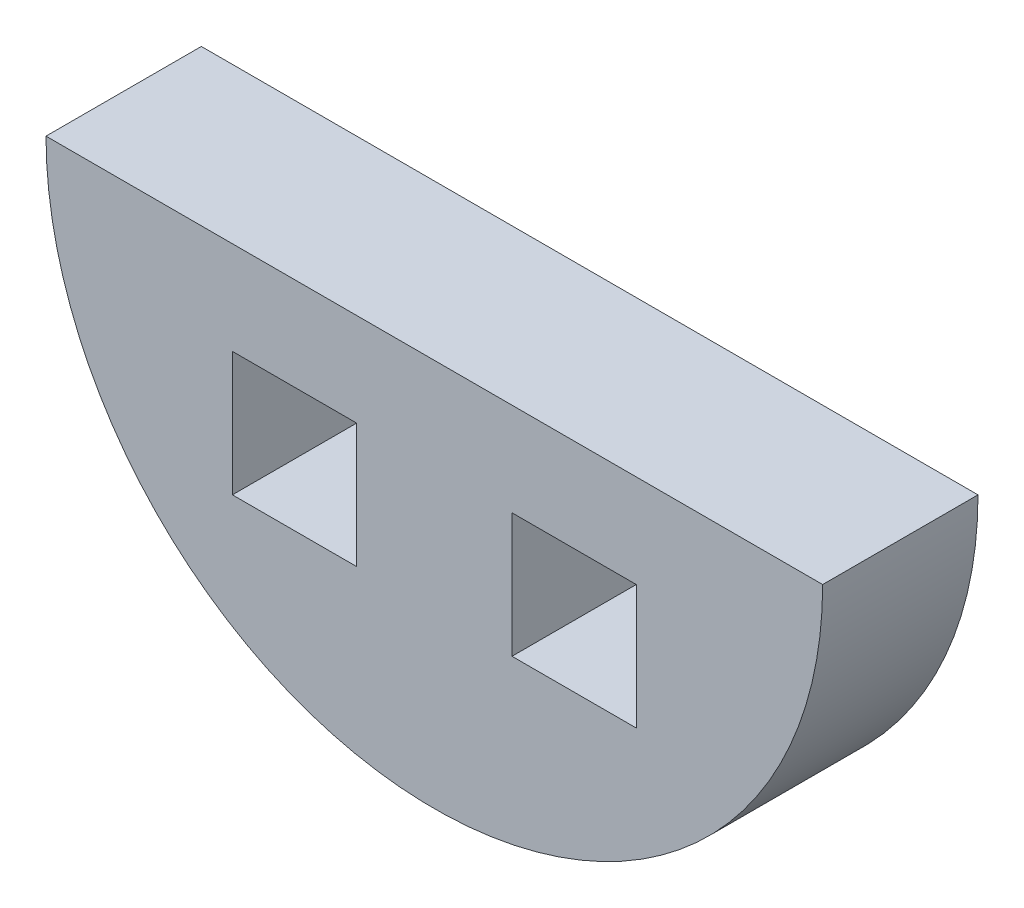
ISO-10303-21;
HEADER;
FILE_DESCRIPTION(('STEP AP214'),'2;1');
FILE_NAME('part.step','',(''),(''),'','','');
FILE_SCHEMA(('AUTOMOTIVE_DESIGN { 1 0 10303 214 1 1 1 1 }'));
ENDSEC;
DATA;
#1=APPLICATION_CONTEXT('core data for automotive mechanical design processes');
#2=APPLICATION_PROTOCOL_DEFINITION('international standard','automotive_design',2000,#1);
#3=PRODUCT_CONTEXT('',#1,'mechanical');
#4=PRODUCT('Part','Part','',(#3));
#5=PRODUCT_RELATED_PRODUCT_CATEGORY('part','',(#4));
#6=PRODUCT_DEFINITION_FORMATION('','',#4);
#7=PRODUCT_DEFINITION_CONTEXT('part definition',#1,'design');
#8=PRODUCT_DEFINITION('design','',#6,#7);
#9=PRODUCT_DEFINITION_SHAPE('','',#8);
#10=(LENGTH_UNIT() NAMED_UNIT(*) SI_UNIT(.MILLI.,.METRE.));
#11=(NAMED_UNIT(*) PLANE_ANGLE_UNIT() SI_UNIT($,.RADIAN.));
#12=(NAMED_UNIT(*) SI_UNIT($,.STERADIAN.) SOLID_ANGLE_UNIT());
#13=UNCERTAINTY_MEASURE_WITH_UNIT(LENGTH_MEASURE(1.E-05),#10,'distance_accuracy_value','');
#14=(GEOMETRIC_REPRESENTATION_CONTEXT(3) GLOBAL_UNCERTAINTY_ASSIGNED_CONTEXT((#13)) GLOBAL_UNIT_ASSIGNED_CONTEXT((#10,
#11,#12)) REPRESENTATION_CONTEXT('',''));
#15=CARTESIAN_POINT('',(0.,0.,0.));
#16=DIRECTION('',(0.,0.,1.));
#17=DIRECTION('',(1.,0.,0.));
#18=AXIS2_PLACEMENT_3D('',#15,#16,#17);
#19=CARTESIAN_POINT('',(-62.5,0.,25.));
#20=DIRECTION('',(0.,0.,1.));
#21=DIRECTION('',(1.,0.,0.));
#22=AXIS2_PLACEMENT_3D('',#19,#20,#21);
#23=PLANE('',#22);
#24=CARTESIAN_POINT('',(-62.5,0.,25.));
#25=DIRECTION('',(0.,0.,1.));
#26=DIRECTION('',(1.,0.,0.));
#27=AXIS2_PLACEMENT_3D('',#24,#25,#26);
#28=CIRCLE('',#27,62.5);
#29=CARTESIAN_POINT('',(-125.,0.,25.));
#30=VERTEX_POINT('',#29);
#31=CARTESIAN_POINT('',(0.,0.,25.));
#32=VERTEX_POINT('',#31);
#33=EDGE_CURVE('E187',#30,#32,#28,.T.);
#34=ORIENTED_EDGE('',*,*,#33,.T.);
#35=DIRECTION('',(-1.,0.,0.));
#36=VECTOR('',#35,1.);
#37=CARTESIAN_POINT('',(-125.,0.,25.));
#38=LINE('',#37,#36);
#39=EDGE_CURVE('E190',#32,#30,#38,.T.);
#40=ORIENTED_EDGE('',*,*,#39,.T.);
#41=EDGE_LOOP('',(#34,#40));
#42=FACE_BOUND('',#41,.T.);
#43=DIRECTION('',(1.,0.,0.));
#44=VECTOR('',#43,1.);
#45=CARTESIAN_POINT('',(-50.,-35.,25.));
#46=LINE('',#45,#44);
#47=CARTESIAN_POINT('',(-50.,-35.,25.));
#48=VERTEX_POINT('',#47);
#49=CARTESIAN_POINT('',(-30.,-35.,25.));
#50=VERTEX_POINT('',#49);
#51=EDGE_CURVE('E158',#48,#50,#46,.T.);
#52=ORIENTED_EDGE('',*,*,#51,.F.);
#53=DIRECTION('',(0.,-1.,0.));
#54=VECTOR('',#53,1.);
#55=CARTESIAN_POINT('',(-50.,-35.,25.));
#56=LINE('',#55,#54);
#57=CARTESIAN_POINT('',(-50.,-15.,25.));
#58=VERTEX_POINT('',#57);
#59=EDGE_CURVE('E156',#58,#48,#56,.T.);
#60=ORIENTED_EDGE('',*,*,#59,.F.);
#61=DIRECTION('',(-1.,0.,0.));
#62=VECTOR('',#61,1.);
#63=CARTESIAN_POINT('',(-50.,-15.,25.));
#64=LINE('',#63,#62);
#65=CARTESIAN_POINT('',(-30.,-15.,25.));
#66=VERTEX_POINT('',#65);
#67=EDGE_CURVE('E164',#66,#58,#64,.T.);
#68=ORIENTED_EDGE('',*,*,#67,.F.);
#69=DIRECTION('',(0.,1.,0.));
#70=VECTOR('',#69,1.);
#71=CARTESIAN_POINT('',(-30.,-35.,25.));
#72=LINE('',#71,#70);
#73=EDGE_CURVE('E161',#50,#66,#72,.T.);
#74=ORIENTED_EDGE('',*,*,#73,.F.);
#75=EDGE_LOOP('',(#52,#60,#68,#74));
#76=FACE_BOUND('',#75,.T.);
#77=DIRECTION('',(1.,0.,0.));
#78=VECTOR('',#77,1.);
#79=CARTESIAN_POINT('',(-95.,-35.,25.));
#80=LINE('',#79,#78);
#81=CARTESIAN_POINT('',(-95.,-35.,25.));
#82=VERTEX_POINT('',#81);
#83=CARTESIAN_POINT('',(-75.,-35.,25.));
#84=VERTEX_POINT('',#83);
#85=EDGE_CURVE('E128',#82,#84,#80,.T.);
#86=ORIENTED_EDGE('',*,*,#85,.F.);
#87=DIRECTION('',(0.,-1.,0.));
#88=VECTOR('',#87,1.);
#89=CARTESIAN_POINT('',(-95.,-35.,25.));
#90=LINE('',#89,#88);
#91=CARTESIAN_POINT('',(-95.,-15.,25.));
#92=VERTEX_POINT('',#91);
#93=EDGE_CURVE('E120',#92,#82,#90,.T.);
#94=ORIENTED_EDGE('',*,*,#93,.F.);
#95=DIRECTION('',(-1.,0.,0.));
#96=VECTOR('',#95,1.);
#97=CARTESIAN_POINT('',(-95.,-15.,25.));
#98=LINE('',#97,#96);
#99=CARTESIAN_POINT('',(-75.,-15.,25.));
#100=VERTEX_POINT('',#99);
#101=EDGE_CURVE('E142',#100,#92,#98,.T.);
#102=ORIENTED_EDGE('',*,*,#101,.F.);
#103=DIRECTION('',(0.,1.,0.));
#104=VECTOR('',#103,1.);
#105=CARTESIAN_POINT('',(-75.,-35.,25.));
#106=LINE('',#105,#104);
#107=EDGE_CURVE('E140',#84,#100,#106,.T.);
#108=ORIENTED_EDGE('',*,*,#107,.F.);
#109=EDGE_LOOP('',(#86,#94,#102,#108));
#110=FACE_BOUND('',#109,.T.);
#111=ADVANCED_FACE('F43',(#42,#76,#110),#23,.T.);
#112=CARTESIAN_POINT('',(-62.5,0.,0.));
#113=DIRECTION('',(0.,0.,1.));
#114=DIRECTION('',(1.,0.,0.));
#115=AXIS2_PLACEMENT_3D('',#112,#113,#114);
#116=PLANE('',#115);
#117=DIRECTION('',(0.,-1.,0.));
#118=VECTOR('',#117,1.);
#119=CARTESIAN_POINT('',(-50.,-35.,0.));
#120=LINE('',#119,#118);
#121=CARTESIAN_POINT('',(-50.,-15.,0.));
#122=VERTEX_POINT('',#121);
#123=CARTESIAN_POINT('',(-50.,-35.,0.));
#124=VERTEX_POINT('',#123);
#125=EDGE_CURVE('E136',#122,#124,#120,.T.);
#126=ORIENTED_EDGE('',*,*,#125,.T.);
#127=DIRECTION('',(1.,0.,0.));
#128=VECTOR('',#127,1.);
#129=CARTESIAN_POINT('',(-50.,-35.,0.));
#130=LINE('',#129,#128);
#131=CARTESIAN_POINT('',(-30.,-35.,0.));
#132=VERTEX_POINT('',#131);
#133=EDGE_CURVE('E169',#124,#132,#130,.T.);
#134=ORIENTED_EDGE('',*,*,#133,.T.);
#135=DIRECTION('',(0.,1.,0.));
#136=VECTOR('',#135,1.);
#137=CARTESIAN_POINT('',(-30.,-35.,0.));
#138=LINE('',#137,#136);
#139=CARTESIAN_POINT('',(-30.,-15.,0.));
#140=VERTEX_POINT('',#139);
#141=EDGE_CURVE('E172',#132,#140,#138,.T.);
#142=ORIENTED_EDGE('',*,*,#141,.T.);
#143=DIRECTION('',(-1.,0.,0.));
#144=VECTOR('',#143,1.);
#145=CARTESIAN_POINT('',(-50.,-15.,0.));
#146=LINE('',#145,#144);
#147=EDGE_CURVE('E159',#140,#122,#146,.T.);
#148=ORIENTED_EDGE('',*,*,#147,.T.);
#149=EDGE_LOOP('',(#126,#134,#142,#148));
#150=FACE_BOUND('',#149,.T.);
#151=CARTESIAN_POINT('',(-62.5,0.,0.));
#152=DIRECTION('',(0.,0.,1.));
#153=DIRECTION('',(1.,0.,0.));
#154=AXIS2_PLACEMENT_3D('',#151,#152,#153);
#155=CIRCLE('',#154,62.5);
#156=CARTESIAN_POINT('',(-125.,0.,0.));
#157=VERTEX_POINT('',#156);
#158=CARTESIAN_POINT('',(0.,0.,0.));
#159=VERTEX_POINT('',#158);
#160=EDGE_CURVE('E186',#157,#159,#155,.T.);
#161=ORIENTED_EDGE('',*,*,#160,.F.);
#162=DIRECTION('',(-1.,0.,0.));
#163=VECTOR('',#162,1.);
#164=CARTESIAN_POINT('',(-125.,0.,0.));
#165=LINE('',#164,#163);
#166=EDGE_CURVE('E191',#159,#157,#165,.T.);
#167=ORIENTED_EDGE('',*,*,#166,.F.);
#168=EDGE_LOOP('',(#161,#167));
#169=FACE_BOUND('',#168,.T.);
#170=DIRECTION('',(0.,-1.,0.));
#171=VECTOR('',#170,1.);
#172=CARTESIAN_POINT('',(-95.,-35.,0.));
#173=LINE('',#172,#171);
#174=CARTESIAN_POINT('',(-95.,-15.,0.));
#175=VERTEX_POINT('',#174);
#176=CARTESIAN_POINT('',(-95.,-35.,0.));
#177=VERTEX_POINT('',#176);
#178=EDGE_CURVE('E66',#175,#177,#173,.T.);
#179=ORIENTED_EDGE('',*,*,#178,.T.);
#180=DIRECTION('',(1.,0.,0.));
#181=VECTOR('',#180,1.);
#182=CARTESIAN_POINT('',(-95.,-35.,0.));
#183=LINE('',#182,#181);
#184=CARTESIAN_POINT('',(-75.,-35.,0.));
#185=VERTEX_POINT('',#184);
#186=EDGE_CURVE('E135',#177,#185,#183,.T.);
#187=ORIENTED_EDGE('',*,*,#186,.T.);
#188=DIRECTION('',(0.,1.,0.));
#189=VECTOR('',#188,1.);
#190=CARTESIAN_POINT('',(-75.,-35.,0.));
#191=LINE('',#190,#189);
#192=CARTESIAN_POINT('',(-75.,-15.,0.));
#193=VERTEX_POINT('',#192);
#194=EDGE_CURVE('E148',#185,#193,#191,.T.);
#195=ORIENTED_EDGE('',*,*,#194,.T.);
#196=DIRECTION('',(-1.,0.,0.));
#197=VECTOR('',#196,1.);
#198=CARTESIAN_POINT('',(-95.,-15.,0.));
#199=LINE('',#198,#197);
#200=EDGE_CURVE('E129',#193,#175,#199,.T.);
#201=ORIENTED_EDGE('',*,*,#200,.T.);
#202=EDGE_LOOP('',(#179,#187,#195,#201));
#203=FACE_BOUND('',#202,.T.);
#204=ADVANCED_FACE('F203',(#150,#169,#203),#116,.F.);
#205=CARTESIAN_POINT('',(-62.5,0.,25.));
#206=DIRECTION('',(0.,0.,-1.));
#207=DIRECTION('',(-1.,0.,0.));
#208=AXIS2_PLACEMENT_3D('',#205,#206,#207);
#209=CYLINDRICAL_SURFACE('',#208,62.5);
#210=ORIENTED_EDGE('',*,*,#160,.T.);
#211=DIRECTION('',(0.,0.,-1.));
#212=VECTOR('',#211,1.);
#213=CARTESIAN_POINT('',(0.,0.,25.));
#214=LINE('',#213,#212);
#215=EDGE_CURVE('E11',#32,#159,#214,.T.);
#216=ORIENTED_EDGE('',*,*,#215,.F.);
#217=ORIENTED_EDGE('',*,*,#33,.F.);
#218=DIRECTION('',(0.,0.,-1.));
#219=VECTOR('',#218,1.);
#220=CARTESIAN_POINT('',(-125.,0.,25.));
#221=LINE('',#220,#219);
#222=EDGE_CURVE('E51',#30,#157,#221,.T.);
#223=ORIENTED_EDGE('',*,*,#222,.T.);
#224=EDGE_LOOP('',(#210,#216,#217,#223));
#225=FACE_BOUND('',#224,.T.);
#226=ADVANCED_FACE('F45',(#225),#209,.T.);
#227=CARTESIAN_POINT('',(-125.,0.,25.));
#228=DIRECTION('',(0.,-1.,0.));
#229=DIRECTION('',(0.,0.,-1.));
#230=AXIS2_PLACEMENT_3D('',#227,#228,#229);
#231=PLANE('',#230);
#232=ORIENTED_EDGE('',*,*,#166,.T.);
#233=ORIENTED_EDGE('',*,*,#222,.F.);
#234=ORIENTED_EDGE('',*,*,#39,.F.);
#235=ORIENTED_EDGE('',*,*,#215,.T.);
#236=EDGE_LOOP('',(#232,#233,#234,#235));
#237=FACE_BOUND('',#236,.T.);
#238=ADVANCED_FACE('F205',(#237),#231,.F.);
#239=CARTESIAN_POINT('',(-50.,-35.,25.));
#240=DIRECTION('',(1.,0.,0.));
#241=DIRECTION('',(0.,0.,-1.));
#242=AXIS2_PLACEMENT_3D('',#239,#240,#241);
#243=PLANE('',#242);
#244=ORIENTED_EDGE('',*,*,#125,.F.);
#245=DIRECTION('',(0.,0.,-1.));
#246=VECTOR('',#245,1.);
#247=CARTESIAN_POINT('',(-50.,-15.,25.));
#248=LINE('',#247,#246);
#249=EDGE_CURVE('E166',#58,#122,#248,.T.);
#250=ORIENTED_EDGE('',*,*,#249,.F.);
#251=ORIENTED_EDGE('',*,*,#59,.T.);
#252=DIRECTION('',(0.,0.,-1.));
#253=VECTOR('',#252,1.);
#254=CARTESIAN_POINT('',(-50.,-35.,25.));
#255=LINE('',#254,#253);
#256=EDGE_CURVE('E183',#48,#124,#255,.T.);
#257=ORIENTED_EDGE('',*,*,#256,.T.);
#258=EDGE_LOOP('',(#244,#250,#251,#257));
#259=FACE_BOUND('',#258,.T.);
#260=ADVANCED_FACE('F224',(#259),#243,.T.);
#261=CARTESIAN_POINT('',(-50.,-35.,25.));
#262=DIRECTION('',(0.,1.,0.));
#263=DIRECTION('',(0.,0.,1.));
#264=AXIS2_PLACEMENT_3D('',#261,#262,#263);
#265=PLANE('',#264);
#266=ORIENTED_EDGE('',*,*,#133,.F.);
#267=ORIENTED_EDGE('',*,*,#256,.F.);
#268=ORIENTED_EDGE('',*,*,#51,.T.);
#269=DIRECTION('',(0.,0.,-1.));
#270=VECTOR('',#269,1.);
#271=CARTESIAN_POINT('',(-30.,-35.,25.));
#272=LINE('',#271,#270);
#273=EDGE_CURVE('E181',#50,#132,#272,.T.);
#274=ORIENTED_EDGE('',*,*,#273,.T.);
#275=EDGE_LOOP('',(#266,#267,#268,#274));
#276=FACE_BOUND('',#275,.T.);
#277=ADVANCED_FACE('F217',(#276),#265,.T.);
#278=CARTESIAN_POINT('',(-30.,-35.,25.));
#279=DIRECTION('',(-1.,0.,0.));
#280=DIRECTION('',(0.,0.,1.));
#281=AXIS2_PLACEMENT_3D('',#278,#279,#280);
#282=PLANE('',#281);
#283=ORIENTED_EDGE('',*,*,#141,.F.);
#284=ORIENTED_EDGE('',*,*,#273,.F.);
#285=ORIENTED_EDGE('',*,*,#73,.T.);
#286=DIRECTION('',(0.,0.,-1.));
#287=VECTOR('',#286,1.);
#288=CARTESIAN_POINT('',(-30.,-15.,25.));
#289=LINE('',#288,#287);
#290=EDGE_CURVE('E179',#66,#140,#289,.T.);
#291=ORIENTED_EDGE('',*,*,#290,.T.);
#292=EDGE_LOOP('',(#283,#284,#285,#291));
#293=FACE_BOUND('',#292,.T.);
#294=ADVANCED_FACE('F220',(#293),#282,.T.);
#295=CARTESIAN_POINT('',(-50.,-15.,25.));
#296=DIRECTION('',(0.,-1.,0.));
#297=DIRECTION('',(1.,0.,0.));
#298=AXIS2_PLACEMENT_3D('',#295,#296,#297);
#299=PLANE('',#298);
#300=ORIENTED_EDGE('',*,*,#147,.F.);
#301=ORIENTED_EDGE('',*,*,#290,.F.);
#302=ORIENTED_EDGE('',*,*,#67,.T.);
#303=ORIENTED_EDGE('',*,*,#249,.T.);
#304=EDGE_LOOP('',(#300,#301,#302,#303));
#305=FACE_BOUND('',#304,.T.);
#306=ADVANCED_FACE('F227',(#305),#299,.T.);
#307=CARTESIAN_POINT('',(-95.,-35.,25.));
#308=DIRECTION('',(1.,0.,0.));
#309=DIRECTION('',(0.,0.,-1.));
#310=AXIS2_PLACEMENT_3D('',#307,#308,#309);
#311=PLANE('',#310);
#312=ORIENTED_EDGE('',*,*,#178,.F.);
#313=DIRECTION('',(0.,0.,-1.));
#314=VECTOR('',#313,1.);
#315=CARTESIAN_POINT('',(-95.,-15.,25.));
#316=LINE('',#315,#314);
#317=EDGE_CURVE('E124',#92,#175,#316,.T.);
#318=ORIENTED_EDGE('',*,*,#317,.F.);
#319=ORIENTED_EDGE('',*,*,#93,.T.);
#320=DIRECTION('',(0.,0.,-1.));
#321=VECTOR('',#320,1.);
#322=CARTESIAN_POINT('',(-95.,-35.,25.));
#323=LINE('',#322,#321);
#324=EDGE_CURVE('E123',#82,#177,#323,.T.);
#325=ORIENTED_EDGE('',*,*,#324,.T.);
#326=EDGE_LOOP('',(#312,#318,#319,#325));
#327=FACE_BOUND('',#326,.T.);
#328=ADVANCED_FACE('F122',(#327),#311,.T.);
#329=CARTESIAN_POINT('',(-95.,-35.,25.));
#330=DIRECTION('',(0.,1.,0.));
#331=DIRECTION('',(0.,0.,1.));
#332=AXIS2_PLACEMENT_3D('',#329,#330,#331);
#333=PLANE('',#332);
#334=ORIENTED_EDGE('',*,*,#186,.F.);
#335=ORIENTED_EDGE('',*,*,#324,.F.);
#336=ORIENTED_EDGE('',*,*,#85,.T.);
#337=DIRECTION('',(0.,0.,-1.));
#338=VECTOR('',#337,1.);
#339=CARTESIAN_POINT('',(-75.,-35.,25.));
#340=LINE('',#339,#338);
#341=EDGE_CURVE('E137',#84,#185,#340,.T.);
#342=ORIENTED_EDGE('',*,*,#341,.T.);
#343=EDGE_LOOP('',(#334,#335,#336,#342));
#344=FACE_BOUND('',#343,.T.);
#345=ADVANCED_FACE('F132',(#344),#333,.T.);
#346=CARTESIAN_POINT('',(-75.,-35.,25.));
#347=DIRECTION('',(-1.,0.,0.));
#348=DIRECTION('',(0.,0.,1.));
#349=AXIS2_PLACEMENT_3D('',#346,#347,#348);
#350=PLANE('',#349);
#351=ORIENTED_EDGE('',*,*,#194,.F.);
#352=ORIENTED_EDGE('',*,*,#341,.F.);
#353=ORIENTED_EDGE('',*,*,#107,.T.);
#354=DIRECTION('',(0.,0.,-1.));
#355=VECTOR('',#354,1.);
#356=CARTESIAN_POINT('',(-75.,-15.,25.));
#357=LINE('',#356,#355);
#358=EDGE_CURVE('E58',#100,#193,#357,.T.);
#359=ORIENTED_EDGE('',*,*,#358,.T.);
#360=EDGE_LOOP('',(#351,#352,#353,#359));
#361=FACE_BOUND('',#360,.T.);
#362=ADVANCED_FACE('F298',(#361),#350,.T.);
#363=CARTESIAN_POINT('',(-95.,-15.,25.));
#364=DIRECTION('',(0.,-1.,0.));
#365=DIRECTION('',(0.,0.,-1.));
#366=AXIS2_PLACEMENT_3D('',#363,#364,#365);
#367=PLANE('',#366);
#368=ORIENTED_EDGE('',*,*,#200,.F.);
#369=ORIENTED_EDGE('',*,*,#358,.F.);
#370=ORIENTED_EDGE('',*,*,#101,.T.);
#371=ORIENTED_EDGE('',*,*,#317,.T.);
#372=EDGE_LOOP('',(#368,#369,#370,#371));
#373=FACE_BOUND('',#372,.T.);
#374=ADVANCED_FACE('F305',(#373),#367,.T.);
#375=CLOSED_SHELL('',(#111,#204,#226,#238,#260,#277,#294,#306,#328,#345,#362,#374));
#376=MANIFOLD_SOLID_BREP('B2',#375);
#377=ADVANCED_BREP_SHAPE_REPRESENTATION('',(#18,#376),#14);
#378=SHAPE_DEFINITION_REPRESENTATION(#9,#377);
ENDSEC;
END-ISO-10303-21;
